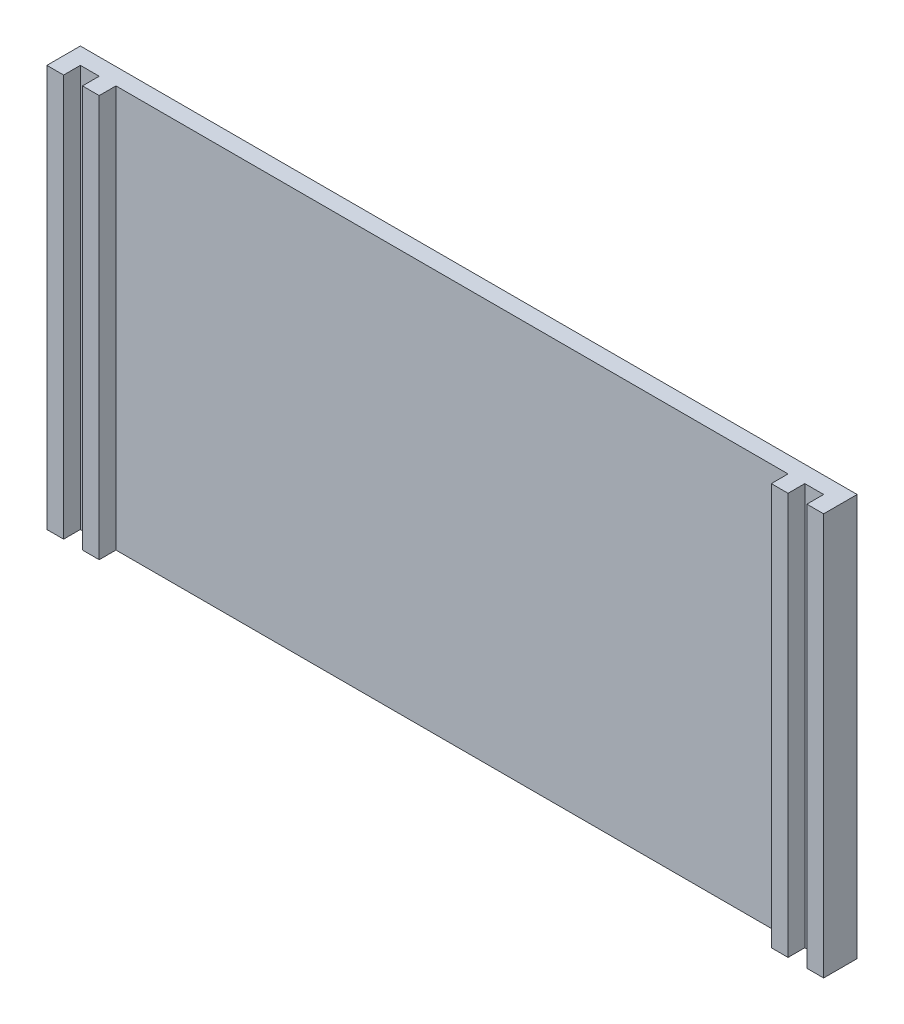
ISO-10303-21;
HEADER;
FILE_DESCRIPTION(('STEP AP214'),'2;1');
FILE_NAME('part.step','',(''),(''),'','','');
FILE_SCHEMA(('AUTOMOTIVE_DESIGN { 1 0 10303 214 1 1 1 1 }'));
ENDSEC;
DATA;
#1=APPLICATION_CONTEXT('core data for automotive mechanical design processes');
#2=APPLICATION_PROTOCOL_DEFINITION('international standard','automotive_design',2000,#1);
#3=PRODUCT_CONTEXT('',#1,'mechanical');
#4=PRODUCT('Part','Part','',(#3));
#5=PRODUCT_RELATED_PRODUCT_CATEGORY('part','',(#4));
#6=PRODUCT_DEFINITION_FORMATION('','',#4);
#7=PRODUCT_DEFINITION_CONTEXT('part definition',#1,'design');
#8=PRODUCT_DEFINITION('design','',#6,#7);
#9=PRODUCT_DEFINITION_SHAPE('','',#8);
#10=(LENGTH_UNIT() NAMED_UNIT(*) SI_UNIT(.MILLI.,.METRE.));
#11=(NAMED_UNIT(*) PLANE_ANGLE_UNIT() SI_UNIT($,.RADIAN.));
#12=(NAMED_UNIT(*) SI_UNIT($,.STERADIAN.) SOLID_ANGLE_UNIT());
#13=UNCERTAINTY_MEASURE_WITH_UNIT(LENGTH_MEASURE(1.E-05),#10,'distance_accuracy_value','');
#14=(GEOMETRIC_REPRESENTATION_CONTEXT(3) GLOBAL_UNCERTAINTY_ASSIGNED_CONTEXT((#13)) GLOBAL_UNIT_ASSIGNED_CONTEXT((#10,
#11,#12)) REPRESENTATION_CONTEXT('',''));
#15=CARTESIAN_POINT('',(0.,0.,0.));
#16=DIRECTION('',(0.,0.,1.));
#17=DIRECTION('',(1.,0.,0.));
#18=AXIS2_PLACEMENT_3D('',#15,#16,#17);
#19=CARTESIAN_POINT('',(-63.4088927024772,96.,-20.4879937354561));
#20=DIRECTION('',(1.,0.,0.));
#21=DIRECTION('',(0.,0.,-1.));
#22=AXIS2_PLACEMENT_3D('',#19,#20,#21);
#23=PLANE('',#22);
#24=DIRECTION('',(0.,0.,1.));
#25=VECTOR('',#24,1.);
#26=CARTESIAN_POINT('',(-63.4088927024772,0.,-20.4879937354561));
#27=LINE('',#26,#25);
#28=CARTESIAN_POINT('',(-63.4088927024772,0.,-20.4879937354561));
#29=VERTEX_POINT('',#28);
#30=CARTESIAN_POINT('',(-63.4088927024772,0.,-12.4879937354561));
#31=VERTEX_POINT('',#30);
#32=EDGE_CURVE('E179',#29,#31,#27,.T.);
#33=ORIENTED_EDGE('',*,*,#32,.T.);
#34=DIRECTION('',(0.,-1.,0.));
#35=VECTOR('',#34,1.);
#36=CARTESIAN_POINT('',(-63.4088927024772,96.,-12.4879937354561));
#37=LINE('',#36,#35);
#38=CARTESIAN_POINT('',(-63.4088927024772,96.,-12.4879937354561));
#39=VERTEX_POINT('',#38);
#40=EDGE_CURVE('E11',#39,#31,#37,.T.);
#41=ORIENTED_EDGE('',*,*,#40,.F.);
#42=DIRECTION('',(0.,0.,1.));
#43=VECTOR('',#42,1.);
#44=CARTESIAN_POINT('',(-63.4088927024772,96.,-20.4879937354561));
#45=LINE('',#44,#43);
#46=CARTESIAN_POINT('',(-63.4088927024772,96.,-20.4879937354561));
#47=VERTEX_POINT('',#46);
#48=EDGE_CURVE('E209',#47,#39,#45,.T.);
#49=ORIENTED_EDGE('',*,*,#48,.F.);
#50=DIRECTION('',(0.,-1.,0.));
#51=VECTOR('',#50,1.);
#52=CARTESIAN_POINT('',(-63.4088927024772,96.,-20.4879937354561));
#53=LINE('',#52,#51);
#54=EDGE_CURVE('E175',#47,#29,#53,.T.);
#55=ORIENTED_EDGE('',*,*,#54,.T.);
#56=EDGE_LOOP('',(#33,#41,#49,#55));
#57=FACE_BOUND('',#56,.T.);
#58=ADVANCED_FACE('F35',(#57),#23,.F.);
#59=CARTESIAN_POINT('',(-63.4088927024772,96.,-12.4879937354561));
#60=DIRECTION('',(0.,0.,-1.));
#61=DIRECTION('',(-1.,0.,0.));
#62=AXIS2_PLACEMENT_3D('',#59,#60,#61);
#63=PLANE('',#62);
#64=DIRECTION('',(1.,0.,0.));
#65=VECTOR('',#64,1.);
#66=CARTESIAN_POINT('',(-63.4088927024772,0.,-12.4879937354561));
#67=LINE('',#66,#65);
#68=CARTESIAN_POINT('',(-59.4088927024772,0.,-12.4879937354561));
#69=VERTEX_POINT('',#68);
#70=EDGE_CURVE('E182',#31,#69,#67,.T.);
#71=ORIENTED_EDGE('',*,*,#70,.T.);
#72=DIRECTION('',(0.,-1.,0.));
#73=VECTOR('',#72,1.);
#74=CARTESIAN_POINT('',(-59.4088927024772,96.,-12.4879937354561));
#75=LINE('',#74,#73);
#76=CARTESIAN_POINT('',(-59.4088927024772,96.,-12.4879937354561));
#77=VERTEX_POINT('',#76);
#78=EDGE_CURVE('E43',#77,#69,#75,.T.);
#79=ORIENTED_EDGE('',*,*,#78,.F.);
#80=DIRECTION('',(1.,0.,0.));
#81=VECTOR('',#80,1.);
#82=CARTESIAN_POINT('',(-63.4088927024772,96.,-12.4879937354561));
#83=LINE('',#82,#81);
#84=EDGE_CURVE('E118',#39,#77,#83,.T.);
#85=ORIENTED_EDGE('',*,*,#84,.F.);
#86=ORIENTED_EDGE('',*,*,#40,.T.);
#87=EDGE_LOOP('',(#71,#79,#85,#86));
#88=FACE_BOUND('',#87,.T.);
#89=ADVANCED_FACE('F307',(#88),#63,.F.);
#90=CARTESIAN_POINT('',(-59.4088927024772,96.,-12.4879937354561));
#91=DIRECTION('',(-1.,0.,0.));
#92=DIRECTION('',(0.,0.,1.));
#93=AXIS2_PLACEMENT_3D('',#90,#91,#92);
#94=PLANE('',#93);
#95=DIRECTION('',(0.,0.,-1.));
#96=VECTOR('',#95,1.);
#97=CARTESIAN_POINT('',(-59.4088927024772,0.,-12.4879937354561));
#98=LINE('',#97,#96);
#99=CARTESIAN_POINT('',(-59.4088927024772,0.,-16.4879937354561));
#100=VERTEX_POINT('',#99);
#101=EDGE_CURVE('E184',#69,#100,#98,.T.);
#102=ORIENTED_EDGE('',*,*,#101,.T.);
#103=DIRECTION('',(0.,-1.,0.));
#104=VECTOR('',#103,1.);
#105=CARTESIAN_POINT('',(-59.4088927024772,96.,-16.4879937354561));
#106=LINE('',#105,#104);
#107=CARTESIAN_POINT('',(-59.4088927024772,96.,-16.4879937354561));
#108=VERTEX_POINT('',#107);
#109=EDGE_CURVE('E240',#108,#100,#106,.T.);
#110=ORIENTED_EDGE('',*,*,#109,.F.);
#111=DIRECTION('',(0.,0.,-1.));
#112=VECTOR('',#111,1.);
#113=CARTESIAN_POINT('',(-59.4088927024772,96.,-12.4879937354561));
#114=LINE('',#113,#112);
#115=EDGE_CURVE('E248',#77,#108,#114,.T.);
#116=ORIENTED_EDGE('',*,*,#115,.F.);
#117=ORIENTED_EDGE('',*,*,#78,.T.);
#118=EDGE_LOOP('',(#102,#110,#116,#117));
#119=FACE_BOUND('',#118,.T.);
#120=ADVANCED_FACE('F246',(#119),#94,.F.);
#121=CARTESIAN_POINT('',(-59.4088927024772,96.,-16.4879937354561));
#122=DIRECTION('',(0.,0.,-1.));
#123=DIRECTION('',(-1.,0.,0.));
#124=AXIS2_PLACEMENT_3D('',#121,#122,#123);
#125=PLANE('',#124);
#126=DIRECTION('',(1.,0.,0.));
#127=VECTOR('',#126,1.);
#128=CARTESIAN_POINT('',(-59.4088927024772,0.,-16.4879937354561));
#129=LINE('',#128,#127);
#130=CARTESIAN_POINT('',(-54.9088927024772,0.,-16.4879937354561));
#131=VERTEX_POINT('',#130);
#132=EDGE_CURVE('E186',#100,#131,#129,.T.);
#133=ORIENTED_EDGE('',*,*,#132,.T.);
#134=DIRECTION('',(0.,-1.,0.));
#135=VECTOR('',#134,1.);
#136=CARTESIAN_POINT('',(-54.9088927024772,96.,-16.4879937354561));
#137=LINE('',#136,#135);
#138=CARTESIAN_POINT('',(-54.9088927024772,96.,-16.4879937354561));
#139=VERTEX_POINT('',#138);
#140=EDGE_CURVE('E237',#139,#131,#137,.T.);
#141=ORIENTED_EDGE('',*,*,#140,.F.);
#142=DIRECTION('',(1.,0.,0.));
#143=VECTOR('',#142,1.);
#144=CARTESIAN_POINT('',(-59.4088927024772,96.,-16.4879937354561));
#145=LINE('',#144,#143);
#146=EDGE_CURVE('E266',#108,#139,#145,.T.);
#147=ORIENTED_EDGE('',*,*,#146,.F.);
#148=ORIENTED_EDGE('',*,*,#109,.T.);
#149=EDGE_LOOP('',(#133,#141,#147,#148));
#150=FACE_BOUND('',#149,.T.);
#151=ADVANCED_FACE('F257',(#150),#125,.F.);
#152=CARTESIAN_POINT('',(-54.9088927024772,96.,-16.4879937354561));
#153=DIRECTION('',(1.,0.,0.));
#154=DIRECTION('',(0.,0.,-1.));
#155=AXIS2_PLACEMENT_3D('',#152,#153,#154);
#156=PLANE('',#155);
#157=DIRECTION('',(0.,0.,1.));
#158=VECTOR('',#157,1.);
#159=CARTESIAN_POINT('',(-54.9088927024772,0.,-16.4879937354561));
#160=LINE('',#159,#158);
#161=CARTESIAN_POINT('',(-54.9088927024772,0.,-12.4879937354561));
#162=VERTEX_POINT('',#161);
#163=EDGE_CURVE('E188',#131,#162,#160,.T.);
#164=ORIENTED_EDGE('',*,*,#163,.T.);
#165=DIRECTION('',(0.,-1.,0.));
#166=VECTOR('',#165,1.);
#167=CARTESIAN_POINT('',(-54.9088927024772,96.,-12.4879937354561));
#168=LINE('',#167,#166);
#169=CARTESIAN_POINT('',(-54.9088927024772,96.,-12.4879937354561));
#170=VERTEX_POINT('',#169);
#171=EDGE_CURVE('E234',#170,#162,#168,.T.);
#172=ORIENTED_EDGE('',*,*,#171,.F.);
#173=DIRECTION('',(0.,0.,1.));
#174=VECTOR('',#173,1.);
#175=CARTESIAN_POINT('',(-54.9088927024772,96.,-16.4879937354561));
#176=LINE('',#175,#174);
#177=EDGE_CURVE('E263',#139,#170,#176,.T.);
#178=ORIENTED_EDGE('',*,*,#177,.F.);
#179=ORIENTED_EDGE('',*,*,#140,.T.);
#180=EDGE_LOOP('',(#164,#172,#178,#179));
#181=FACE_BOUND('',#180,.T.);
#182=ADVANCED_FACE('F261',(#181),#156,.F.);
#183=CARTESIAN_POINT('',(-54.9088927024772,96.,-12.4879937354561));
#184=DIRECTION('',(0.,0.,-1.));
#185=DIRECTION('',(-1.,0.,0.));
#186=AXIS2_PLACEMENT_3D('',#183,#184,#185);
#187=PLANE('',#186);
#188=DIRECTION('',(1.,0.,0.));
#189=VECTOR('',#188,1.);
#190=CARTESIAN_POINT('',(-54.9088927024772,0.,-12.4879937354561));
#191=LINE('',#190,#189);
#192=CARTESIAN_POINT('',(-50.9088927024772,0.,-12.4879937354561));
#193=VERTEX_POINT('',#192);
#194=EDGE_CURVE('E190',#162,#193,#191,.T.);
#195=ORIENTED_EDGE('',*,*,#194,.T.);
#196=DIRECTION('',(0.,-1.,0.));
#197=VECTOR('',#196,1.);
#198=CARTESIAN_POINT('',(-50.9088927024772,96.,-12.4879937354561));
#199=LINE('',#198,#197);
#200=CARTESIAN_POINT('',(-50.9088927024772,96.,-12.4879937354561));
#201=VERTEX_POINT('',#200);
#202=EDGE_CURVE('E231',#201,#193,#199,.T.);
#203=ORIENTED_EDGE('',*,*,#202,.F.);
#204=DIRECTION('',(1.,0.,0.));
#205=VECTOR('',#204,1.);
#206=CARTESIAN_POINT('',(-54.9088927024772,96.,-12.4879937354561));
#207=LINE('',#206,#205);
#208=EDGE_CURVE('E265',#170,#201,#207,.T.);
#209=ORIENTED_EDGE('',*,*,#208,.F.);
#210=ORIENTED_EDGE('',*,*,#171,.T.);
#211=EDGE_LOOP('',(#195,#203,#209,#210));
#212=FACE_BOUND('',#211,.T.);
#213=ADVANCED_FACE('F320',(#212),#187,.F.);
#214=CARTESIAN_POINT('',(-50.9088927024772,96.,-12.4879937354561));
#215=DIRECTION('',(-1.,0.,0.));
#216=DIRECTION('',(0.,0.,1.));
#217=AXIS2_PLACEMENT_3D('',#214,#215,#216);
#218=PLANE('',#217);
#219=DIRECTION('',(0.,0.,-1.));
#220=VECTOR('',#219,1.);
#221=CARTESIAN_POINT('',(-50.9088927024772,0.,-12.4879937354561));
#222=LINE('',#221,#220);
#223=CARTESIAN_POINT('',(-50.9088927024772,0.,-16.4879937354561));
#224=VERTEX_POINT('',#223);
#225=EDGE_CURVE('E192',#193,#224,#222,.T.);
#226=ORIENTED_EDGE('',*,*,#225,.T.);
#227=DIRECTION('',(0.,-1.,0.));
#228=VECTOR('',#227,1.);
#229=CARTESIAN_POINT('',(-50.9088927024772,96.,-16.4879937354561));
#230=LINE('',#229,#228);
#231=CARTESIAN_POINT('',(-50.9088927024772,96.,-16.4879937354561));
#232=VERTEX_POINT('',#231);
#233=EDGE_CURVE('E228',#232,#224,#230,.T.);
#234=ORIENTED_EDGE('',*,*,#233,.F.);
#235=DIRECTION('',(0.,0.,-1.));
#236=VECTOR('',#235,1.);
#237=CARTESIAN_POINT('',(-50.9088927024772,96.,-12.4879937354561));
#238=LINE('',#237,#236);
#239=EDGE_CURVE('E268',#201,#232,#238,.T.);
#240=ORIENTED_EDGE('',*,*,#239,.F.);
#241=ORIENTED_EDGE('',*,*,#202,.T.);
#242=EDGE_LOOP('',(#226,#234,#240,#241));
#243=FACE_BOUND('',#242,.T.);
#244=ADVANCED_FACE('F323',(#243),#218,.F.);
#245=CARTESIAN_POINT('',(-50.9088927024772,96.,-16.4879937354561));
#246=DIRECTION('',(0.,0.,-1.));
#247=DIRECTION('',(-1.,0.,0.));
#248=AXIS2_PLACEMENT_3D('',#245,#246,#247);
#249=PLANE('',#248);
#250=DIRECTION('',(1.,0.,0.));
#251=VECTOR('',#250,1.);
#252=CARTESIAN_POINT('',(-50.9088927024772,0.,-16.4879937354561));
#253=LINE('',#252,#251);
#254=CARTESIAN_POINT('',(109.591107297523,0.,-16.4879937354561));
#255=VERTEX_POINT('',#254);
#256=EDGE_CURVE('E194',#224,#255,#253,.T.);
#257=ORIENTED_EDGE('',*,*,#256,.T.);
#258=DIRECTION('',(0.,-1.,0.));
#259=VECTOR('',#258,1.);
#260=CARTESIAN_POINT('',(109.591107297523,96.,-16.4879937354561));
#261=LINE('',#260,#259);
#262=CARTESIAN_POINT('',(109.591107297523,96.,-16.4879937354561));
#263=VERTEX_POINT('',#262);
#264=EDGE_CURVE('E225',#263,#255,#261,.T.);
#265=ORIENTED_EDGE('',*,*,#264,.F.);
#266=DIRECTION('',(1.,0.,0.));
#267=VECTOR('',#266,1.);
#268=CARTESIAN_POINT('',(-50.9088927024772,96.,-16.4879937354561));
#269=LINE('',#268,#267);
#270=EDGE_CURVE('E274',#232,#263,#269,.T.);
#271=ORIENTED_EDGE('',*,*,#270,.F.);
#272=ORIENTED_EDGE('',*,*,#233,.T.);
#273=EDGE_LOOP('',(#257,#265,#271,#272));
#274=FACE_BOUND('',#273,.T.);
#275=ADVANCED_FACE('F327',(#274),#249,.F.);
#276=CARTESIAN_POINT('',(109.591107297523,96.,-12.4879937354561));
#277=DIRECTION('',(1.,0.,0.));
#278=DIRECTION('',(0.,0.,-1.));
#279=AXIS2_PLACEMENT_3D('',#276,#277,#278);
#280=PLANE('',#279);
#281=DIRECTION('',(0.,0.,1.));
#282=VECTOR('',#281,1.);
#283=CARTESIAN_POINT('',(109.591107297523,0.,-12.4879937354561));
#284=LINE('',#283,#282);
#285=CARTESIAN_POINT('',(109.591107297523,0.,-12.4879937354561));
#286=VERTEX_POINT('',#285);
#287=EDGE_CURVE('E196',#255,#286,#284,.T.);
#288=ORIENTED_EDGE('',*,*,#287,.T.);
#289=DIRECTION('',(0.,-1.,0.));
#290=VECTOR('',#289,1.);
#291=CARTESIAN_POINT('',(109.591107297523,96.,-12.4879937354561));
#292=LINE('',#291,#290);
#293=CARTESIAN_POINT('',(109.591107297523,96.,-12.4879937354561));
#294=VERTEX_POINT('',#293);
#295=EDGE_CURVE('E222',#294,#286,#292,.T.);
#296=ORIENTED_EDGE('',*,*,#295,.F.);
#297=DIRECTION('',(0.,0.,1.));
#298=VECTOR('',#297,1.);
#299=CARTESIAN_POINT('',(109.591107297523,96.,-12.4879937354561));
#300=LINE('',#299,#298);
#301=EDGE_CURVE('E276',#263,#294,#300,.T.);
#302=ORIENTED_EDGE('',*,*,#301,.F.);
#303=ORIENTED_EDGE('',*,*,#264,.T.);
#304=EDGE_LOOP('',(#288,#296,#302,#303));
#305=FACE_BOUND('',#304,.T.);
#306=ADVANCED_FACE('F331',(#305),#280,.F.);
#307=CARTESIAN_POINT('',(113.591107297523,96.,-12.4879937354561));
#308=DIRECTION('',(0.,0.,-1.));
#309=DIRECTION('',(-1.,0.,0.));
#310=AXIS2_PLACEMENT_3D('',#307,#308,#309);
#311=PLANE('',#310);
#312=DIRECTION('',(1.,0.,0.));
#313=VECTOR('',#312,1.);
#314=CARTESIAN_POINT('',(113.591107297523,0.,-12.4879937354561));
#315=LINE('',#314,#313);
#316=CARTESIAN_POINT('',(113.591107297523,0.,-12.4879937354561));
#317=VERTEX_POINT('',#316);
#318=EDGE_CURVE('E198',#286,#317,#315,.T.);
#319=ORIENTED_EDGE('',*,*,#318,.T.);
#320=DIRECTION('',(0.,-1.,0.));
#321=VECTOR('',#320,1.);
#322=CARTESIAN_POINT('',(113.591107297523,96.,-12.4879937354561));
#323=LINE('',#322,#321);
#324=CARTESIAN_POINT('',(113.591107297523,96.,-12.4879937354561));
#325=VERTEX_POINT('',#324);
#326=EDGE_CURVE('E219',#325,#317,#323,.T.);
#327=ORIENTED_EDGE('',*,*,#326,.F.);
#328=DIRECTION('',(1.,0.,0.));
#329=VECTOR('',#328,1.);
#330=CARTESIAN_POINT('',(113.591107297523,96.,-12.4879937354561));
#331=LINE('',#330,#329);
#332=EDGE_CURVE('E278',#294,#325,#331,.T.);
#333=ORIENTED_EDGE('',*,*,#332,.F.);
#334=ORIENTED_EDGE('',*,*,#295,.T.);
#335=EDGE_LOOP('',(#319,#327,#333,#334));
#336=FACE_BOUND('',#335,.T.);
#337=ADVANCED_FACE('F335',(#336),#311,.F.);
#338=CARTESIAN_POINT('',(113.591107297523,96.,-16.4879937354561));
#339=DIRECTION('',(-1.,0.,0.));
#340=DIRECTION('',(0.,0.,1.));
#341=AXIS2_PLACEMENT_3D('',#338,#339,#340);
#342=PLANE('',#341);
#343=DIRECTION('',(0.,0.,-1.));
#344=VECTOR('',#343,1.);
#345=CARTESIAN_POINT('',(113.591107297523,0.,-16.4879937354561));
#346=LINE('',#345,#344);
#347=CARTESIAN_POINT('',(113.591107297523,0.,-16.4879937354561));
#348=VERTEX_POINT('',#347);
#349=EDGE_CURVE('E200',#317,#348,#346,.T.);
#350=ORIENTED_EDGE('',*,*,#349,.T.);
#351=DIRECTION('',(0.,-1.,0.));
#352=VECTOR('',#351,1.);
#353=CARTESIAN_POINT('',(113.591107297523,96.,-16.4879937354561));
#354=LINE('',#353,#352);
#355=CARTESIAN_POINT('',(113.591107297523,96.,-16.4879937354561));
#356=VERTEX_POINT('',#355);
#357=EDGE_CURVE('E216',#356,#348,#354,.T.);
#358=ORIENTED_EDGE('',*,*,#357,.F.);
#359=DIRECTION('',(0.,0.,-1.));
#360=VECTOR('',#359,1.);
#361=CARTESIAN_POINT('',(113.591107297523,96.,-16.4879937354561));
#362=LINE('',#361,#360);
#363=EDGE_CURVE('E280',#325,#356,#362,.T.);
#364=ORIENTED_EDGE('',*,*,#363,.F.);
#365=ORIENTED_EDGE('',*,*,#326,.T.);
#366=EDGE_LOOP('',(#350,#358,#364,#365));
#367=FACE_BOUND('',#366,.T.);
#368=ADVANCED_FACE('F339',(#367),#342,.F.);
#369=CARTESIAN_POINT('',(118.091107297523,96.,-16.4879937354561));
#370=DIRECTION('',(0.,0.,-1.));
#371=DIRECTION('',(-1.,0.,0.));
#372=AXIS2_PLACEMENT_3D('',#369,#370,#371);
#373=PLANE('',#372);
#374=DIRECTION('',(1.,0.,0.));
#375=VECTOR('',#374,1.);
#376=CARTESIAN_POINT('',(118.091107297523,0.,-16.4879937354561));
#377=LINE('',#376,#375);
#378=CARTESIAN_POINT('',(118.091107297523,0.,-16.4879937354561));
#379=VERTEX_POINT('',#378);
#380=EDGE_CURVE('E202',#348,#379,#377,.T.);
#381=ORIENTED_EDGE('',*,*,#380,.T.);
#382=DIRECTION('',(0.,-1.,0.));
#383=VECTOR('',#382,1.);
#384=CARTESIAN_POINT('',(118.091107297523,96.,-16.4879937354561));
#385=LINE('',#384,#383);
#386=CARTESIAN_POINT('',(118.091107297523,96.,-16.4879937354561));
#387=VERTEX_POINT('',#386);
#388=EDGE_CURVE('E213',#387,#379,#385,.T.);
#389=ORIENTED_EDGE('',*,*,#388,.F.);
#390=DIRECTION('',(1.,0.,0.));
#391=VECTOR('',#390,1.);
#392=CARTESIAN_POINT('',(118.091107297523,96.,-16.4879937354561));
#393=LINE('',#392,#391);
#394=EDGE_CURVE('E282',#356,#387,#393,.T.);
#395=ORIENTED_EDGE('',*,*,#394,.F.);
#396=ORIENTED_EDGE('',*,*,#357,.T.);
#397=EDGE_LOOP('',(#381,#389,#395,#396));
#398=FACE_BOUND('',#397,.T.);
#399=ADVANCED_FACE('F288',(#398),#373,.F.);
#400=CARTESIAN_POINT('',(118.091107297523,96.,-12.4879937354561));
#401=DIRECTION('',(1.,0.,0.));
#402=DIRECTION('',(0.,0.,-1.));
#403=AXIS2_PLACEMENT_3D('',#400,#401,#402);
#404=PLANE('',#403);
#405=DIRECTION('',(0.,0.,1.));
#406=VECTOR('',#405,1.);
#407=CARTESIAN_POINT('',(118.091107297523,0.,-12.4879937354561));
#408=LINE('',#407,#406);
#409=CARTESIAN_POINT('',(118.091107297523,0.,-12.4879937354561));
#410=VERTEX_POINT('',#409);
#411=EDGE_CURVE('E204',#379,#410,#408,.T.);
#412=ORIENTED_EDGE('',*,*,#411,.T.);
#413=DIRECTION('',(0.,-1.,0.));
#414=VECTOR('',#413,1.);
#415=CARTESIAN_POINT('',(118.091107297523,96.,-12.4879937354561));
#416=LINE('',#415,#414);
#417=CARTESIAN_POINT('',(118.091107297523,96.,-12.4879937354561));
#418=VERTEX_POINT('',#417);
#419=EDGE_CURVE('E170',#418,#410,#416,.T.);
#420=ORIENTED_EDGE('',*,*,#419,.F.);
#421=DIRECTION('',(0.,0.,1.));
#422=VECTOR('',#421,1.);
#423=CARTESIAN_POINT('',(118.091107297523,96.,-12.4879937354561));
#424=LINE('',#423,#422);
#425=EDGE_CURVE('E161',#387,#418,#424,.T.);
#426=ORIENTED_EDGE('',*,*,#425,.F.);
#427=ORIENTED_EDGE('',*,*,#388,.T.);
#428=EDGE_LOOP('',(#412,#420,#426,#427));
#429=FACE_BOUND('',#428,.T.);
#430=ADVANCED_FACE('F292',(#429),#404,.F.);
#431=CARTESIAN_POINT('',(122.091107297523,96.,-12.4879937354561));
#432=DIRECTION('',(0.,0.,-1.));
#433=DIRECTION('',(-1.,0.,0.));
#434=AXIS2_PLACEMENT_3D('',#431,#432,#433);
#435=PLANE('',#434);
#436=DIRECTION('',(1.,0.,0.));
#437=VECTOR('',#436,1.);
#438=CARTESIAN_POINT('',(122.091107297523,0.,-12.4879937354561));
#439=LINE('',#438,#437);
#440=CARTESIAN_POINT('',(122.091107297523,0.,-12.4879937354561));
#441=VERTEX_POINT('',#440);
#442=EDGE_CURVE('E169',#410,#441,#439,.T.);
#443=ORIENTED_EDGE('',*,*,#442,.T.);
#444=DIRECTION('',(0.,-1.,0.));
#445=VECTOR('',#444,1.);
#446=CARTESIAN_POINT('',(122.091107297523,96.,-12.4879937354561));
#447=LINE('',#446,#445);
#448=CARTESIAN_POINT('',(122.091107297523,96.,-12.4879937354561));
#449=VERTEX_POINT('',#448);
#450=EDGE_CURVE('E166',#449,#441,#447,.T.);
#451=ORIENTED_EDGE('',*,*,#450,.F.);
#452=DIRECTION('',(1.,0.,0.));
#453=VECTOR('',#452,1.);
#454=CARTESIAN_POINT('',(122.091107297523,96.,-12.4879937354561));
#455=LINE('',#454,#453);
#456=EDGE_CURVE('E155',#418,#449,#455,.T.);
#457=ORIENTED_EDGE('',*,*,#456,.F.);
#458=ORIENTED_EDGE('',*,*,#419,.T.);
#459=EDGE_LOOP('',(#443,#451,#457,#458));
#460=FACE_BOUND('',#459,.T.);
#461=ADVANCED_FACE('F167',(#460),#435,.F.);
#462=CARTESIAN_POINT('',(122.091107297523,96.,-20.4879937354561));
#463=DIRECTION('',(-1.,0.,0.));
#464=DIRECTION('',(0.,0.,1.));
#465=AXIS2_PLACEMENT_3D('',#462,#463,#464);
#466=PLANE('',#465);
#467=DIRECTION('',(0.,0.,-1.));
#468=VECTOR('',#467,1.);
#469=CARTESIAN_POINT('',(122.091107297523,0.,-20.4879937354561));
#470=LINE('',#469,#468);
#471=CARTESIAN_POINT('',(122.091107297523,0.,-20.4879937354561));
#472=VERTEX_POINT('',#471);
#473=EDGE_CURVE('E104',#441,#472,#470,.T.);
#474=ORIENTED_EDGE('',*,*,#473,.T.);
#475=DIRECTION('',(0.,-1.,0.));
#476=VECTOR('',#475,1.);
#477=CARTESIAN_POINT('',(122.091107297523,96.,-20.4879937354561));
#478=LINE('',#477,#476);
#479=CARTESIAN_POINT('',(122.091107297523,96.,-20.4879937354561));
#480=VERTEX_POINT('',#479);
#481=EDGE_CURVE('E171',#480,#472,#478,.T.);
#482=ORIENTED_EDGE('',*,*,#481,.F.);
#483=DIRECTION('',(0.,0.,-1.));
#484=VECTOR('',#483,1.);
#485=CARTESIAN_POINT('',(122.091107297523,96.,-20.4879937354561));
#486=LINE('',#485,#484);
#487=EDGE_CURVE('E159',#449,#480,#486,.T.);
#488=ORIENTED_EDGE('',*,*,#487,.F.);
#489=ORIENTED_EDGE('',*,*,#450,.T.);
#490=EDGE_LOOP('',(#474,#482,#488,#489));
#491=FACE_BOUND('',#490,.T.);
#492=ADVANCED_FACE('F173',(#491),#466,.F.);
#493=CARTESIAN_POINT('',(-63.4088927024772,96.,-20.4879937354561));
#494=DIRECTION('',(0.,0.,1.));
#495=DIRECTION('',(1.,0.,0.));
#496=AXIS2_PLACEMENT_3D('',#493,#494,#495);
#497=PLANE('',#496);
#498=DIRECTION('',(-1.,0.,0.));
#499=VECTOR('',#498,1.);
#500=CARTESIAN_POINT('',(-63.4088927024772,0.,-20.4879937354561));
#501=LINE('',#500,#499);
#502=EDGE_CURVE('E110',#472,#29,#501,.T.);
#503=ORIENTED_EDGE('',*,*,#502,.T.);
#504=ORIENTED_EDGE('',*,*,#54,.F.);
#505=DIRECTION('',(-1.,0.,0.));
#506=VECTOR('',#505,1.);
#507=CARTESIAN_POINT('',(-63.4088927024772,96.,-20.4879937354561));
#508=LINE('',#507,#506);
#509=EDGE_CURVE('E51',#480,#47,#508,.T.);
#510=ORIENTED_EDGE('',*,*,#509,.F.);
#511=ORIENTED_EDGE('',*,*,#481,.T.);
#512=EDGE_LOOP('',(#503,#504,#510,#511));
#513=FACE_BOUND('',#512,.T.);
#514=ADVANCED_FACE('F296',(#513),#497,.F.);
#515=CARTESIAN_POINT('',(0.,96.,0.));
#516=DIRECTION('',(0.,1.,0.));
#517=DIRECTION('',(0.,0.,1.));
#518=AXIS2_PLACEMENT_3D('',#515,#516,#517);
#519=PLANE('',#518);
#520=ORIENTED_EDGE('',*,*,#48,.T.);
#521=ORIENTED_EDGE('',*,*,#84,.T.);
#522=ORIENTED_EDGE('',*,*,#115,.T.);
#523=ORIENTED_EDGE('',*,*,#146,.T.);
#524=ORIENTED_EDGE('',*,*,#177,.T.);
#525=ORIENTED_EDGE('',*,*,#208,.T.);
#526=ORIENTED_EDGE('',*,*,#239,.T.);
#527=ORIENTED_EDGE('',*,*,#270,.T.);
#528=ORIENTED_EDGE('',*,*,#301,.T.);
#529=ORIENTED_EDGE('',*,*,#332,.T.);
#530=ORIENTED_EDGE('',*,*,#363,.T.);
#531=ORIENTED_EDGE('',*,*,#394,.T.);
#532=ORIENTED_EDGE('',*,*,#425,.T.);
#533=ORIENTED_EDGE('',*,*,#456,.T.);
#534=ORIENTED_EDGE('',*,*,#487,.T.);
#535=ORIENTED_EDGE('',*,*,#509,.T.);
#536=EDGE_LOOP('',(#520,#521,#522,#523,#524,#525,#526,#527,#528,#529,#530,#531,#532,#533,#534,#535));
#537=FACE_BOUND('',#536,.T.);
#538=ADVANCED_FACE('F157',(#537),#519,.T.);
#539=CARTESIAN_POINT('',(0.,0.,0.));
#540=DIRECTION('',(0.,1.,0.));
#541=DIRECTION('',(0.,0.,1.));
#542=AXIS2_PLACEMENT_3D('',#539,#540,#541);
#543=PLANE('',#542);
#544=ORIENTED_EDGE('',*,*,#32,.F.);
#545=ORIENTED_EDGE('',*,*,#502,.F.);
#546=ORIENTED_EDGE('',*,*,#473,.F.);
#547=ORIENTED_EDGE('',*,*,#442,.F.);
#548=ORIENTED_EDGE('',*,*,#411,.F.);
#549=ORIENTED_EDGE('',*,*,#380,.F.);
#550=ORIENTED_EDGE('',*,*,#349,.F.);
#551=ORIENTED_EDGE('',*,*,#318,.F.);
#552=ORIENTED_EDGE('',*,*,#287,.F.);
#553=ORIENTED_EDGE('',*,*,#256,.F.);
#554=ORIENTED_EDGE('',*,*,#225,.F.);
#555=ORIENTED_EDGE('',*,*,#194,.F.);
#556=ORIENTED_EDGE('',*,*,#163,.F.);
#557=ORIENTED_EDGE('',*,*,#132,.F.);
#558=ORIENTED_EDGE('',*,*,#101,.F.);
#559=ORIENTED_EDGE('',*,*,#70,.F.);
#560=EDGE_LOOP('',(#544,#545,#546,#547,#548,#549,#550,#551,#552,#553,#554,#555,#556,#557,#558,#559));
#561=FACE_BOUND('',#560,.T.);
#562=ADVANCED_FACE('F252',(#561),#543,.F.);
#563=CLOSED_SHELL('',(#58,#89,#120,#151,#182,#213,#244,#275,#306,#337,#368,#399,#430,#461,#492,
#514,#538,#562));
#564=MANIFOLD_SOLID_BREP('B2',#563);
#565=ADVANCED_BREP_SHAPE_REPRESENTATION('',(#18,#564),#14);
#566=SHAPE_DEFINITION_REPRESENTATION(#9,#565);
ENDSEC;
END-ISO-10303-21;
